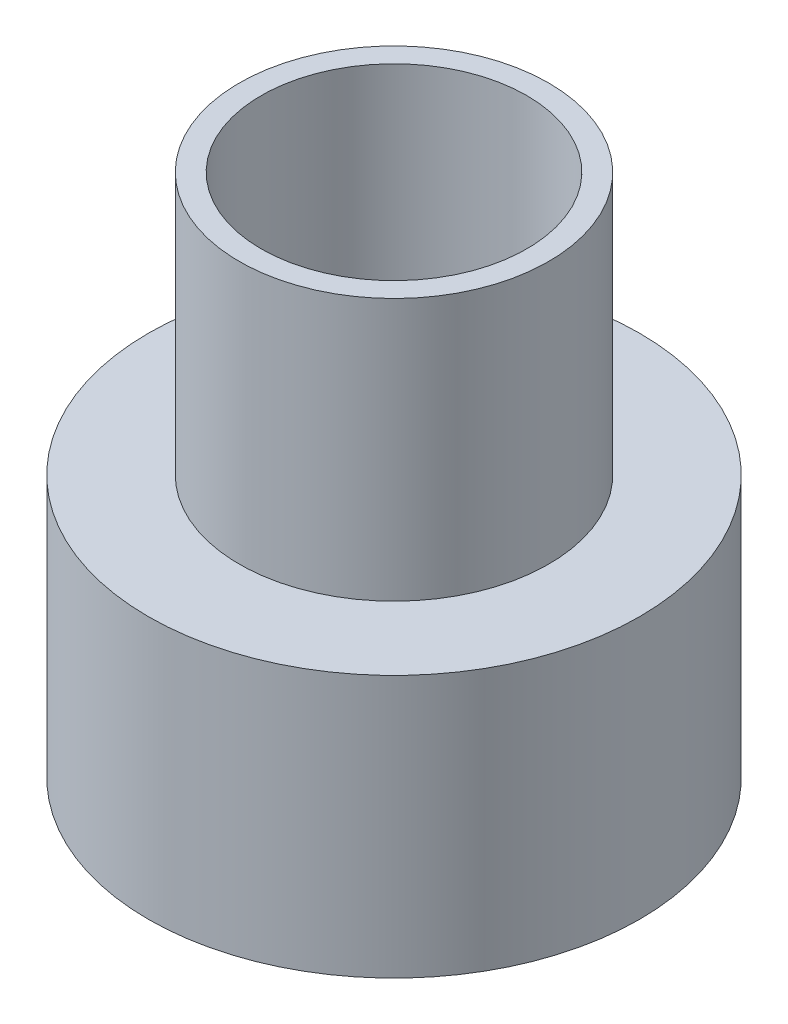
ISO-10303-21;
HEADER;
FILE_DESCRIPTION(('STEP AP214'),'2;1');
FILE_NAME('part.step','',(''),(''),'','','');
FILE_SCHEMA(('AUTOMOTIVE_DESIGN { 1 0 10303 214 1 1 1 1 }'));
ENDSEC;
DATA;
#1=APPLICATION_CONTEXT('core data for automotive mechanical design processes');
#2=APPLICATION_PROTOCOL_DEFINITION('international standard','automotive_design',2000,#1);
#3=PRODUCT_CONTEXT('',#1,'mechanical');
#4=PRODUCT('Part','Part','',(#3));
#5=PRODUCT_RELATED_PRODUCT_CATEGORY('part','',(#4));
#6=PRODUCT_DEFINITION_FORMATION('','',#4);
#7=PRODUCT_DEFINITION_CONTEXT('part definition',#1,'design');
#8=PRODUCT_DEFINITION('design','',#6,#7);
#9=PRODUCT_DEFINITION_SHAPE('','',#8);
#10=(LENGTH_UNIT() NAMED_UNIT(*) SI_UNIT(.MILLI.,.METRE.));
#11=(NAMED_UNIT(*) PLANE_ANGLE_UNIT() SI_UNIT($,.RADIAN.));
#12=(NAMED_UNIT(*) SI_UNIT($,.STERADIAN.) SOLID_ANGLE_UNIT());
#13=UNCERTAINTY_MEASURE_WITH_UNIT(LENGTH_MEASURE(1.E-05),#10,'distance_accuracy_value','');
#14=(GEOMETRIC_REPRESENTATION_CONTEXT(3) GLOBAL_UNCERTAINTY_ASSIGNED_CONTEXT((#13)) GLOBAL_UNIT_ASSIGNED_CONTEXT((#10,
#11,#12)) REPRESENTATION_CONTEXT('',''));
#15=CARTESIAN_POINT('',(0.,0.,0.));
#16=DIRECTION('',(0.,0.,1.));
#17=DIRECTION('',(1.,0.,0.));
#18=AXIS2_PLACEMENT_3D('',#15,#16,#17);
#19=CARTESIAN_POINT('',(-19.304,38.1,0.));
#20=DIRECTION('',(0.,-1.,0.));
#21=DIRECTION('',(0.,0.,-1.));
#22=AXIS2_PLACEMENT_3D('',#19,#20,#21);
#23=PLANE('',#22);
#24=CARTESIAN_POINT('',(0.,38.1,0.));
#25=DIRECTION('',(0.,-1.,0.));
#26=DIRECTION('',(0.,0.,-1.));
#27=AXIS2_PLACEMENT_3D('',#24,#25,#26);
#28=CIRCLE('',#27,22.479);
#29=CARTESIAN_POINT('',(0.,38.1,-22.479));
#30=VERTEX_POINT('',#29);
#31=EDGE_CURVE('E10',#30,#30,#28,.T.);
#32=ORIENTED_EDGE('',*,*,#31,.F.);
#33=EDGE_LOOP('',(#32));
#34=FACE_BOUND('',#33,.T.);
#35=CARTESIAN_POINT('',(0.,38.1,0.));
#36=DIRECTION('',(0.,-1.,0.));
#37=DIRECTION('',(0.,0.,-1.));
#38=AXIS2_PLACEMENT_3D('',#35,#36,#37);
#39=CIRCLE('',#38,19.304);
#40=CARTESIAN_POINT('',(0.,38.1,-19.304));
#41=VERTEX_POINT('',#40);
#42=EDGE_CURVE('E72',#41,#41,#39,.T.);
#43=ORIENTED_EDGE('',*,*,#42,.T.);
#44=EDGE_LOOP('',(#43));
#45=FACE_BOUND('',#44,.T.);
#46=ADVANCED_FACE('F32',(#34,#45),#23,.F.);
#47=CARTESIAN_POINT('',(0.,-55.8394142150601,0.));
#48=DIRECTION('',(0.,-1.,0.));
#49=DIRECTION('',(0.,0.,-1.));
#50=AXIS2_PLACEMENT_3D('',#47,#48,#49);
#51=CYLINDRICAL_SURFACE('',#50,22.479);
#52=CARTESIAN_POINT('',(0.,0.,0.));
#53=DIRECTION('',(0.,-1.,0.));
#54=DIRECTION('',(0.,0.,-1.));
#55=AXIS2_PLACEMENT_3D('',#52,#53,#54);
#56=CIRCLE('',#55,22.479);
#57=CARTESIAN_POINT('',(0.,0.,-22.479));
#58=VERTEX_POINT('',#57);
#59=EDGE_CURVE('E38',#58,#58,#56,.T.);
#60=ORIENTED_EDGE('',*,*,#59,.F.);
#61=EDGE_LOOP('',(#60));
#62=FACE_BOUND('',#61,.T.);
#63=ORIENTED_EDGE('',*,*,#31,.T.);
#64=EDGE_LOOP('',(#63));
#65=FACE_BOUND('',#64,.T.);
#66=ADVANCED_FACE('F133',(#62,#65),#51,.T.);
#67=CARTESIAN_POINT('',(-22.479,0.,0.));
#68=DIRECTION('',(0.,-1.,0.));
#69=DIRECTION('',(0.,0.,-1.));
#70=AXIS2_PLACEMENT_3D('',#67,#68,#69);
#71=PLANE('',#70);
#72=CARTESIAN_POINT('',(0.,0.,0.));
#73=DIRECTION('',(0.,-1.,0.));
#74=DIRECTION('',(0.,0.,-1.));
#75=AXIS2_PLACEMENT_3D('',#72,#73,#74);
#76=CIRCLE('',#75,35.687);
#77=CARTESIAN_POINT('',(0.,0.,-35.687));
#78=VERTEX_POINT('',#77);
#79=EDGE_CURVE('E42',#78,#78,#76,.T.);
#80=ORIENTED_EDGE('',*,*,#79,.F.);
#81=EDGE_LOOP('',(#80));
#82=FACE_BOUND('',#81,.T.);
#83=ORIENTED_EDGE('',*,*,#59,.T.);
#84=EDGE_LOOP('',(#83));
#85=FACE_BOUND('',#84,.T.);
#86=ADVANCED_FACE('F128',(#82,#85),#71,.F.);
#87=CARTESIAN_POINT('',(0.,-55.8394142150601,0.));
#88=DIRECTION('',(0.,-1.,0.));
#89=DIRECTION('',(0.,0.,-1.));
#90=AXIS2_PLACEMENT_3D('',#87,#88,#89);
#91=CYLINDRICAL_SURFACE('',#90,35.687);
#92=CARTESIAN_POINT('',(0.,-38.1,0.));
#93=DIRECTION('',(0.,-1.,0.));
#94=DIRECTION('',(0.,0.,-1.));
#95=AXIS2_PLACEMENT_3D('',#92,#93,#94);
#96=CIRCLE('',#95,35.687);
#97=CARTESIAN_POINT('',(0.,-38.1,-35.687));
#98=VERTEX_POINT('',#97);
#99=EDGE_CURVE('E46',#98,#98,#96,.T.);
#100=ORIENTED_EDGE('',*,*,#99,.F.);
#101=EDGE_LOOP('',(#100));
#102=FACE_BOUND('',#101,.T.);
#103=ORIENTED_EDGE('',*,*,#79,.T.);
#104=EDGE_LOOP('',(#103));
#105=FACE_BOUND('',#104,.T.);
#106=ADVANCED_FACE('F122',(#102,#105),#91,.T.);
#107=CARTESIAN_POINT('',(-35.687,-38.1,0.));
#108=DIRECTION('',(0.,1.,0.));
#109=DIRECTION('',(0.,0.,1.));
#110=AXIS2_PLACEMENT_3D('',#107,#108,#109);
#111=PLANE('',#110);
#112=CARTESIAN_POINT('',(0.,-38.1,0.));
#113=DIRECTION('',(0.,-1.,0.));
#114=DIRECTION('',(0.,0.,-1.));
#115=AXIS2_PLACEMENT_3D('',#112,#113,#114);
#116=CIRCLE('',#115,32.512);
#117=CARTESIAN_POINT('',(0.,-38.1,-32.512));
#118=VERTEX_POINT('',#117);
#119=EDGE_CURVE('E51',#118,#118,#116,.T.);
#120=ORIENTED_EDGE('',*,*,#119,.F.);
#121=EDGE_LOOP('',(#120));
#122=FACE_BOUND('',#121,.T.);
#123=ORIENTED_EDGE('',*,*,#99,.T.);
#124=EDGE_LOOP('',(#123));
#125=FACE_BOUND('',#124,.T.);
#126=ADVANCED_FACE('F116',(#122,#125),#111,.F.);
#127=CARTESIAN_POINT('',(0.,-55.8394142150601,0.));
#128=DIRECTION('',(0.,-1.,0.));
#129=DIRECTION('',(0.,0.,-1.));
#130=AXIS2_PLACEMENT_3D('',#127,#128,#129);
#131=CYLINDRICAL_SURFACE('',#130,32.512);
#132=CARTESIAN_POINT('',(0.,-3.175,0.));
#133=DIRECTION('',(0.,-1.,0.));
#134=DIRECTION('',(0.,0.,-1.));
#135=AXIS2_PLACEMENT_3D('',#132,#133,#134);
#136=CIRCLE('',#135,32.512);
#137=CARTESIAN_POINT('',(0.,-3.175,-32.512));
#138=VERTEX_POINT('',#137);
#139=EDGE_CURVE('E54',#138,#138,#136,.T.);
#140=ORIENTED_EDGE('',*,*,#139,.F.);
#141=EDGE_LOOP('',(#140));
#142=FACE_BOUND('',#141,.T.);
#143=ORIENTED_EDGE('',*,*,#119,.T.);
#144=EDGE_LOOP('',(#143));
#145=FACE_BOUND('',#144,.T.);
#146=ADVANCED_FACE('F110',(#142,#145),#131,.F.);
#147=CARTESIAN_POINT('',(-32.512,-3.17499999999999,0.));
#148=DIRECTION('',(0.,1.,0.));
#149=DIRECTION('',(0.,0.,1.));
#150=AXIS2_PLACEMENT_3D('',#147,#148,#149);
#151=PLANE('',#150);
#152=CARTESIAN_POINT('',(0.,-3.17499999999999,0.));
#153=DIRECTION('',(0.,-1.,0.));
#154=DIRECTION('',(0.,0.,-1.));
#155=AXIS2_PLACEMENT_3D('',#152,#153,#154);
#156=CIRCLE('',#155,25.654);
#157=CARTESIAN_POINT('',(0.,-3.17499999999999,-25.654));
#158=VERTEX_POINT('',#157);
#159=EDGE_CURVE('E57',#158,#158,#156,.T.);
#160=ORIENTED_EDGE('',*,*,#159,.F.);
#161=EDGE_LOOP('',(#160));
#162=FACE_BOUND('',#161,.T.);
#163=ORIENTED_EDGE('',*,*,#139,.T.);
#164=EDGE_LOOP('',(#163));
#165=FACE_BOUND('',#164,.T.);
#166=ADVANCED_FACE('F104',(#162,#165),#151,.F.);
#167=CARTESIAN_POINT('',(0.,-55.8394142150601,0.));
#168=DIRECTION('',(0.,-1.,0.));
#169=DIRECTION('',(0.,0.,-1.));
#170=AXIS2_PLACEMENT_3D('',#167,#168,#169);
#171=CYLINDRICAL_SURFACE('',#170,25.654);
#172=CARTESIAN_POINT('',(0.,-8.25499999999999,0.));
#173=DIRECTION('',(0.,-1.,0.));
#174=DIRECTION('',(0.,0.,-1.));
#175=AXIS2_PLACEMENT_3D('',#172,#173,#174);
#176=CIRCLE('',#175,25.654);
#177=CARTESIAN_POINT('',(0.,-8.25499999999999,-25.654));
#178=VERTEX_POINT('',#177);
#179=EDGE_CURVE('E60',#178,#178,#176,.T.);
#180=ORIENTED_EDGE('',*,*,#179,.F.);
#181=EDGE_LOOP('',(#180));
#182=FACE_BOUND('',#181,.T.);
#183=ORIENTED_EDGE('',*,*,#159,.T.);
#184=EDGE_LOOP('',(#183));
#185=FACE_BOUND('',#184,.T.);
#186=ADVANCED_FACE('F98',(#182,#185),#171,.T.);
#187=CARTESIAN_POINT('',(-25.654,-8.25499999999999,0.));
#188=DIRECTION('',(0.,1.,0.));
#189=DIRECTION('',(0.,0.,1.));
#190=AXIS2_PLACEMENT_3D('',#187,#188,#189);
#191=PLANE('',#190);
#192=CARTESIAN_POINT('',(0.,-8.25499999999999,0.));
#193=DIRECTION('',(0.,-1.,0.));
#194=DIRECTION('',(0.,0.,-1.));
#195=AXIS2_PLACEMENT_3D('',#192,#193,#194);
#196=CIRCLE('',#195,22.479);
#197=CARTESIAN_POINT('',(0.,-8.25499999999999,-22.479));
#198=VERTEX_POINT('',#197);
#199=EDGE_CURVE('E63',#198,#198,#196,.T.);
#200=ORIENTED_EDGE('',*,*,#199,.F.);
#201=EDGE_LOOP('',(#200));
#202=FACE_BOUND('',#201,.T.);
#203=ORIENTED_EDGE('',*,*,#179,.T.);
#204=EDGE_LOOP('',(#203));
#205=FACE_BOUND('',#204,.T.);
#206=ADVANCED_FACE('F92',(#202,#205),#191,.F.);
#207=CARTESIAN_POINT('',(0.,-55.8394142150601,0.));
#208=DIRECTION('',(0.,-1.,0.));
#209=DIRECTION('',(0.,0.,-1.));
#210=AXIS2_PLACEMENT_3D('',#207,#208,#209);
#211=CYLINDRICAL_SURFACE('',#210,22.479);
#212=CARTESIAN_POINT('',(0.,-3.17499999999999,0.));
#213=DIRECTION('',(0.,-1.,0.));
#214=DIRECTION('',(0.,0.,-1.));
#215=AXIS2_PLACEMENT_3D('',#212,#213,#214);
#216=CIRCLE('',#215,22.479);
#217=CARTESIAN_POINT('',(0.,-3.17499999999999,-22.479));
#218=VERTEX_POINT('',#217);
#219=EDGE_CURVE('E66',#218,#218,#216,.T.);
#220=ORIENTED_EDGE('',*,*,#219,.F.);
#221=EDGE_LOOP('',(#220));
#222=FACE_BOUND('',#221,.T.);
#223=ORIENTED_EDGE('',*,*,#199,.T.);
#224=EDGE_LOOP('',(#223));
#225=FACE_BOUND('',#224,.T.);
#226=ADVANCED_FACE('F86',(#222,#225),#211,.F.);
#227=CARTESIAN_POINT('',(-22.479,-3.17499999999999,0.));
#228=DIRECTION('',(0.,1.,0.));
#229=DIRECTION('',(0.,0.,1.));
#230=AXIS2_PLACEMENT_3D('',#227,#228,#229);
#231=PLANE('',#230);
#232=CARTESIAN_POINT('',(0.,-3.17499999999999,0.));
#233=DIRECTION('',(0.,-1.,0.));
#234=DIRECTION('',(0.,0.,-1.));
#235=AXIS2_PLACEMENT_3D('',#232,#233,#234);
#236=CIRCLE('',#235,19.304);
#237=CARTESIAN_POINT('',(0.,-3.17499999999999,-19.304));
#238=VERTEX_POINT('',#237);
#239=EDGE_CURVE('E69',#238,#238,#236,.T.);
#240=ORIENTED_EDGE('',*,*,#239,.F.);
#241=EDGE_LOOP('',(#240));
#242=FACE_BOUND('',#241,.T.);
#243=ORIENTED_EDGE('',*,*,#219,.T.);
#244=EDGE_LOOP('',(#243));
#245=FACE_BOUND('',#244,.T.);
#246=ADVANCED_FACE('F80',(#242,#245),#231,.F.);
#247=CARTESIAN_POINT('',(0.,-55.8394142150601,0.));
#248=DIRECTION('',(0.,-1.,0.));
#249=DIRECTION('',(0.,0.,-1.));
#250=AXIS2_PLACEMENT_3D('',#247,#248,#249);
#251=CYLINDRICAL_SURFACE('',#250,19.304);
#252=ORIENTED_EDGE('',*,*,#42,.F.);
#253=EDGE_LOOP('',(#252));
#254=FACE_BOUND('',#253,.T.);
#255=ORIENTED_EDGE('',*,*,#239,.T.);
#256=EDGE_LOOP('',(#255));
#257=FACE_BOUND('',#256,.T.);
#258=ADVANCED_FACE('F77',(#254,#257),#251,.F.);
#259=CLOSED_SHELL('',(#46,#66,#86,#106,#126,#146,#166,#186,#206,#226,#246,#258));
#260=MANIFOLD_SOLID_BREP('B2',#259);
#261=ADVANCED_BREP_SHAPE_REPRESENTATION('',(#18,#260),#14);
#262=SHAPE_DEFINITION_REPRESENTATION(#9,#261);
ENDSEC;
END-ISO-10303-21;
